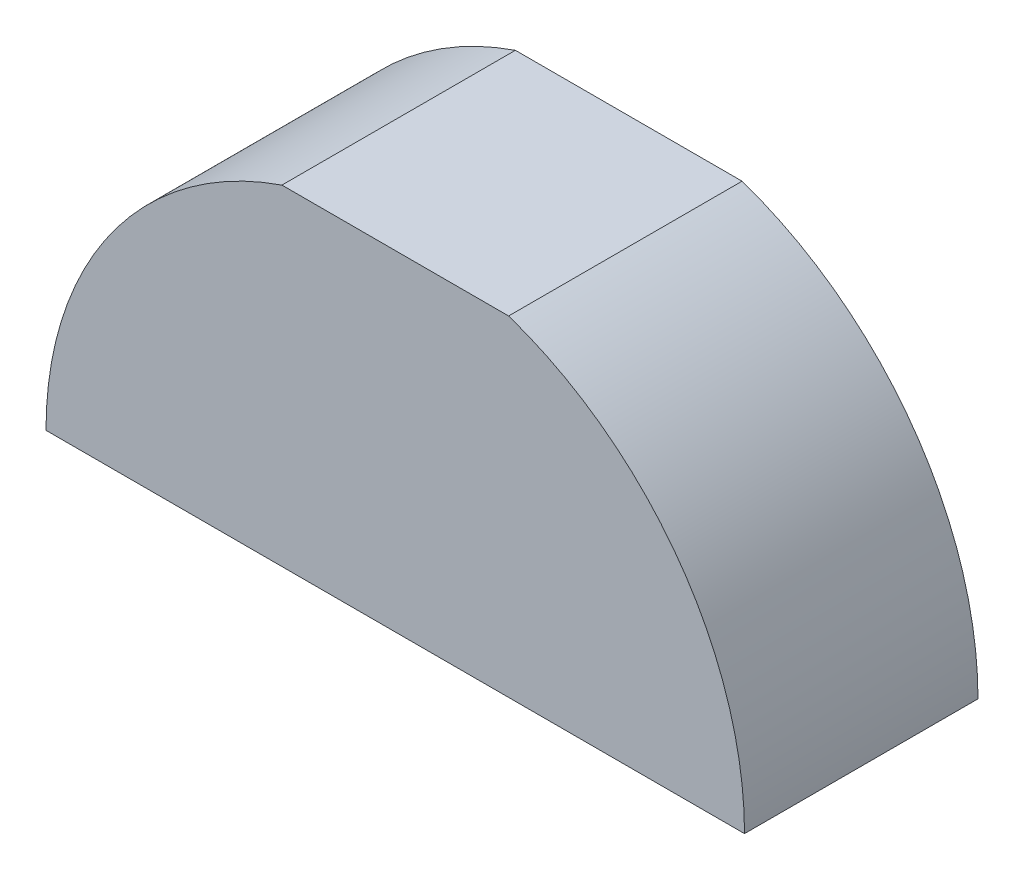
ISO-10303-21;
HEADER;
FILE_DESCRIPTION(('STEP AP214'),'2;1');
FILE_NAME('part.step','',(''),(''),'','','');
FILE_SCHEMA(('AUTOMOTIVE_DESIGN { 1 0 10303 214 1 1 1 1 }'));
ENDSEC;
DATA;
#1=APPLICATION_CONTEXT('core data for automotive mechanical design processes');
#2=APPLICATION_PROTOCOL_DEFINITION('international standard','automotive_design',2000,#1);
#3=PRODUCT_CONTEXT('',#1,'mechanical');
#4=PRODUCT('Part','Part','',(#3));
#5=PRODUCT_RELATED_PRODUCT_CATEGORY('part','',(#4));
#6=PRODUCT_DEFINITION_FORMATION('','',#4);
#7=PRODUCT_DEFINITION_CONTEXT('part definition',#1,'design');
#8=PRODUCT_DEFINITION('design','',#6,#7);
#9=PRODUCT_DEFINITION_SHAPE('','',#8);
#10=(LENGTH_UNIT() NAMED_UNIT(*) SI_UNIT(.MILLI.,.METRE.));
#11=(NAMED_UNIT(*) PLANE_ANGLE_UNIT() SI_UNIT($,.RADIAN.));
#12=(NAMED_UNIT(*) SI_UNIT($,.STERADIAN.) SOLID_ANGLE_UNIT());
#13=UNCERTAINTY_MEASURE_WITH_UNIT(LENGTH_MEASURE(1.E-05),#10,'distance_accuracy_value','');
#14=(GEOMETRIC_REPRESENTATION_CONTEXT(3) GLOBAL_UNCERTAINTY_ASSIGNED_CONTEXT((#13)) GLOBAL_UNIT_ASSIGNED_CONTEXT((#10,
#11,#12)) REPRESENTATION_CONTEXT('',''));
#15=CARTESIAN_POINT('',(0.,0.,0.));
#16=DIRECTION('',(0.,0.,1.));
#17=DIRECTION('',(1.,0.,0.));
#18=AXIS2_PLACEMENT_3D('',#15,#16,#17);
#19=CARTESIAN_POINT('',(-4.95530411937367,-1.00613961606655E-13,3.17500000000023));
#20=DIRECTION('',(0.,0.,-1.00000000000001));
#21=DIRECTION('',(-0.999999999999994,0.,0.));
#22=AXIS2_PLACEMENT_3D('',#19,#20,#21);
#23=CYLINDRICAL_SURFACE('',#22,4.7498);
#24=DIRECTION('',(0.,0.,-1.00000000000001));
#25=VECTOR('',#24,1.);
#26=CARTESIAN_POINT('',(-3.41380321013625,4.49270241467405,13.8566108545707));
#27=LINE('',#26,#25);
#28=CARTESIAN_POINT('',(-3.41380321013623,4.492702414674,3.17500000000025));
#29=VERTEX_POINT('',#28);
#30=CARTESIAN_POINT('',(-3.41380321013622,4.49270241467409,0.));
#31=VERTEX_POINT('',#30);
#32=EDGE_CURVE('E59',#29,#31,#27,.T.);
#33=ORIENTED_EDGE('',*,*,#32,.F.);
#34=CARTESIAN_POINT('',(-4.95530411937367,-1.00613961606655E-13,3.17500000000023));
#35=DIRECTION('',(0.,0.,1.00000000000001));
#36=DIRECTION('',(-0.999999999999994,0.,0.));
#37=AXIS2_PLACEMENT_3D('',#34,#35,#36);
#38=CIRCLE('',#37,4.7498);
#39=CARTESIAN_POINT('',(-0.205504119373631,-1.00613961606655E-13,3.17500000000001));
#40=VERTEX_POINT('',#39);
#41=EDGE_CURVE('E94',#40,#29,#38,.T.);
#42=ORIENTED_EDGE('',*,*,#41,.F.);
#43=DIRECTION('',(0.,0.,-1.00000000000001));
#44=VECTOR('',#43,1.);
#45=CARTESIAN_POINT('',(-0.205504119373631,-1.00613961606655E-13,3.17500000000001));
#46=LINE('',#45,#44);
#47=CARTESIAN_POINT('',(-0.205504119373617,0.,0.));
#48=VERTEX_POINT('',#47);
#49=EDGE_CURVE('E83',#40,#48,#46,.T.);
#50=ORIENTED_EDGE('',*,*,#49,.T.);
#51=CARTESIAN_POINT('',(-4.95530411937362,0.,0.));
#52=DIRECTION('',(0.,0.,1.00000000000001));
#53=DIRECTION('',(-0.999999999999994,0.,0.));
#54=AXIS2_PLACEMENT_3D('',#51,#52,#53);
#55=CIRCLE('',#54,4.7498);
#56=EDGE_CURVE('E90',#48,#31,#55,.T.);
#57=ORIENTED_EDGE('',*,*,#56,.T.);
#58=EDGE_LOOP('',(#33,#42,#50,#57));
#59=FACE_BOUND('',#58,.T.);
#60=ADVANCED_FACE('F45',(#59),#23,.T.);
#61=DIRECTION('',(0.,0.,-1.00000000000001));
#62=VECTOR('',#61,1.);
#63=CARTESIAN_POINT('',(-6.49680502861119,4.49270241467399,13.8566108545708));
#64=LINE('',#63,#62);
#65=CARTESIAN_POINT('',(-6.49680502861098,4.492702414674,3.17500000000025));
#66=VERTEX_POINT('',#65);
#67=CARTESIAN_POINT('',(-6.49680502861102,4.49270241467406,0.));
#68=VERTEX_POINT('',#67);
#69=EDGE_CURVE('E104',#66,#68,#64,.T.);
#70=ORIENTED_EDGE('',*,*,#69,.T.);
#71=CARTESIAN_POINT('',(-9.70510411937363,0.,0.));
#72=VERTEX_POINT('',#71);
#73=EDGE_CURVE('E97',#68,#72,#55,.T.);
#74=ORIENTED_EDGE('',*,*,#73,.T.);
#75=DIRECTION('',(0.,0.,-1.00000000000001));
#76=VECTOR('',#75,1.);
#77=CARTESIAN_POINT('',(-9.70510411937361,-1.83880688453542E-13,3.17500000000001));
#78=LINE('',#77,#76);
#79=CARTESIAN_POINT('',(-9.70510411937361,-1.83880688453542E-13,3.17500000000001));
#80=VERTEX_POINT('',#79);
#81=EDGE_CURVE('E52',#80,#72,#78,.T.);
#82=ORIENTED_EDGE('',*,*,#81,.F.);
#83=EDGE_CURVE('E89',#66,#80,#38,.T.);
#84=ORIENTED_EDGE('',*,*,#83,.F.);
#85=EDGE_LOOP('',(#70,#74,#82,#84));
#86=FACE_BOUND('',#85,.T.);
#87=ADVANCED_FACE('F111',(#86),#23,.T.);
#88=CARTESIAN_POINT('',(-4.95530411937367,-1.00613961606655E-13,3.17500000000023));
#89=DIRECTION('',(0.,0.,-1.00000000000001));
#90=DIRECTION('',(-0.999999999999994,0.,0.));
#91=AXIS2_PLACEMENT_3D('',#88,#89,#90);
#92=PLANE('',#91);
#93=DIRECTION('',(0.999999999999994,0.,0.));
#94=VECTOR('',#93,1.);
#95=CARTESIAN_POINT('',(-4.95530411937357,4.492702414674,3.17500000000026));
#96=LINE('',#95,#94);
#97=EDGE_CURVE('E99',#66,#29,#96,.T.);
#98=ORIENTED_EDGE('',*,*,#97,.F.);
#99=ORIENTED_EDGE('',*,*,#83,.T.);
#100=DIRECTION('',(0.999999999999994,0.,0.));
#101=VECTOR('',#100,1.);
#102=CARTESIAN_POINT('',(-9.70510411937361,-1.83880688453542E-13,3.17500000000001));
#103=LINE('',#102,#101);
#104=EDGE_CURVE('E67',#80,#40,#103,.T.);
#105=ORIENTED_EDGE('',*,*,#104,.T.);
#106=ORIENTED_EDGE('',*,*,#41,.T.);
#107=EDGE_LOOP('',(#98,#99,#105,#106));
#108=FACE_BOUND('',#107,.T.);
#109=ADVANCED_FACE('F117',(#108),#92,.F.);
#110=CARTESIAN_POINT('',(-4.95530411937362,0.,0.));
#111=DIRECTION('',(0.,0.,-1.00000000000001));
#112=DIRECTION('',(-0.999999999999994,0.,0.));
#113=AXIS2_PLACEMENT_3D('',#110,#111,#112);
#114=PLANE('',#113);
#115=ORIENTED_EDGE('',*,*,#73,.F.);
#116=DIRECTION('',(0.999999999999994,0.,0.));
#117=VECTOR('',#116,1.);
#118=CARTESIAN_POINT('',(-4.95530411937363,4.49270241467406,0.));
#119=LINE('',#118,#117);
#120=EDGE_CURVE('E13',#68,#31,#119,.T.);
#121=ORIENTED_EDGE('',*,*,#120,.T.);
#122=ORIENTED_EDGE('',*,*,#56,.F.);
#123=DIRECTION('',(0.999999999999994,0.,0.));
#124=VECTOR('',#123,1.);
#125=CARTESIAN_POINT('',(-9.70510411937363,0.,0.));
#126=LINE('',#125,#124);
#127=EDGE_CURVE('E80',#72,#48,#126,.T.);
#128=ORIENTED_EDGE('',*,*,#127,.F.);
#129=EDGE_LOOP('',(#115,#121,#122,#128));
#130=FACE_BOUND('',#129,.T.);
#131=ADVANCED_FACE('F96',(#130),#114,.T.);
#132=CARTESIAN_POINT('',(-9.70510411937361,-1.83880688453542E-13,3.17500000000001));
#133=DIRECTION('',(0.,0.999999999999991,0.));
#134=DIRECTION('',(0.,0.,1.00000000000001));
#135=AXIS2_PLACEMENT_3D('',#132,#133,#134);
#136=PLANE('',#135);
#137=ORIENTED_EDGE('',*,*,#127,.T.);
#138=ORIENTED_EDGE('',*,*,#49,.F.);
#139=ORIENTED_EDGE('',*,*,#104,.F.);
#140=ORIENTED_EDGE('',*,*,#81,.T.);
#141=EDGE_LOOP('',(#137,#138,#139,#140));
#142=FACE_BOUND('',#141,.T.);
#143=ADVANCED_FACE('F82',(#142),#136,.F.);
#144=CARTESIAN_POINT('',(-6.49680502861119,4.49270241467399,13.8566108545708));
#145=DIRECTION('',(0.,0.999999999999991,0.));
#146=DIRECTION('',(0.,0.,1.00000000000001));
#147=AXIS2_PLACEMENT_3D('',#144,#145,#146);
#148=PLANE('',#147);
#149=ORIENTED_EDGE('',*,*,#69,.F.);
#150=ORIENTED_EDGE('',*,*,#97,.T.);
#151=ORIENTED_EDGE('',*,*,#32,.T.);
#152=ORIENTED_EDGE('',*,*,#120,.F.);
#153=EDGE_LOOP('',(#149,#150,#151,#152));
#154=FACE_BOUND('',#153,.T.);
#155=ADVANCED_FACE('F115',(#154),#148,.T.);
#156=CLOSED_SHELL('',(#60,#87,#109,#131,#143,#155));
#157=MANIFOLD_SOLID_BREP('B2',#156);
#158=ADVANCED_BREP_SHAPE_REPRESENTATION('',(#18,#157),#14);
#159=SHAPE_DEFINITION_REPRESENTATION(#9,#158);
ENDSEC;
END-ISO-10303-21;
